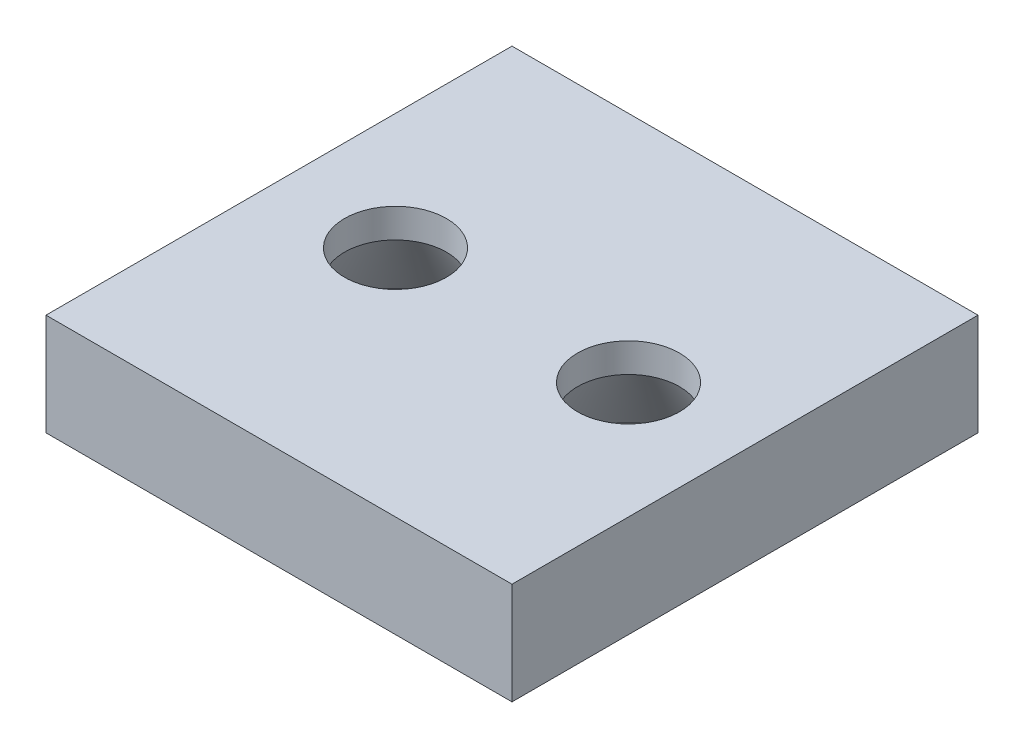
ISO-10303-21;
HEADER;
FILE_DESCRIPTION(('STEP AP214'),'2;1');
FILE_NAME('part.step','',(''),(''),'','','');
FILE_SCHEMA(('AUTOMOTIVE_DESIGN { 1 0 10303 214 1 1 1 1 }'));
ENDSEC;
DATA;
#1=APPLICATION_CONTEXT('core data for automotive mechanical design processes');
#2=APPLICATION_PROTOCOL_DEFINITION('international standard','automotive_design',2000,#1);
#3=PRODUCT_CONTEXT('',#1,'mechanical');
#4=PRODUCT('Part','Part','',(#3));
#5=PRODUCT_RELATED_PRODUCT_CATEGORY('part','',(#4));
#6=PRODUCT_DEFINITION_FORMATION('','',#4);
#7=PRODUCT_DEFINITION_CONTEXT('part definition',#1,'design');
#8=PRODUCT_DEFINITION('design','',#6,#7);
#9=PRODUCT_DEFINITION_SHAPE('','',#8);
#10=(LENGTH_UNIT() NAMED_UNIT(*) SI_UNIT(.MILLI.,.METRE.));
#11=(NAMED_UNIT(*) PLANE_ANGLE_UNIT() SI_UNIT($,.RADIAN.));
#12=(NAMED_UNIT(*) SI_UNIT($,.STERADIAN.) SOLID_ANGLE_UNIT());
#13=UNCERTAINTY_MEASURE_WITH_UNIT(LENGTH_MEASURE(1.E-05),#10,'distance_accuracy_value','');
#14=(GEOMETRIC_REPRESENTATION_CONTEXT(3) GLOBAL_UNCERTAINTY_ASSIGNED_CONTEXT((#13)) GLOBAL_UNIT_ASSIGNED_CONTEXT((#10,
#11,#12)) REPRESENTATION_CONTEXT('',''));
#15=CARTESIAN_POINT('',(0.,0.,0.));
#16=DIRECTION('',(0.,0.,1.));
#17=DIRECTION('',(1.,0.,0.));
#18=AXIS2_PLACEMENT_3D('',#15,#16,#17);
#19=CARTESIAN_POINT('',(-16.,7.,-16.));
#20=DIRECTION('',(0.,0.,-1.));
#21=DIRECTION('',(-1.,0.,0.));
#22=AXIS2_PLACEMENT_3D('',#19,#20,#21);
#23=PLANE('',#22);
#24=DIRECTION('',(1.,0.,0.));
#25=VECTOR('',#24,1.);
#26=CARTESIAN_POINT('',(-16.,0.,-16.));
#27=LINE('',#26,#25);
#28=CARTESIAN_POINT('',(-16.,0.,-16.));
#29=VERTEX_POINT('',#28);
#30=CARTESIAN_POINT('',(16.,0.,-16.));
#31=VERTEX_POINT('',#30);
#32=EDGE_CURVE('E117',#29,#31,#27,.T.);
#33=ORIENTED_EDGE('',*,*,#32,.F.);
#34=DIRECTION('',(0.,-1.,0.));
#35=VECTOR('',#34,1.);
#36=CARTESIAN_POINT('',(-16.,7.,-16.));
#37=LINE('',#36,#35);
#38=CARTESIAN_POINT('',(-16.,7.,-16.));
#39=VERTEX_POINT('',#38);
#40=EDGE_CURVE('E11',#39,#29,#37,.T.);
#41=ORIENTED_EDGE('',*,*,#40,.F.);
#42=DIRECTION('',(1.,0.,0.));
#43=VECTOR('',#42,1.);
#44=CARTESIAN_POINT('',(-16.,7.,-16.));
#45=LINE('',#44,#43);
#46=CARTESIAN_POINT('',(16.,7.,-16.));
#47=VERTEX_POINT('',#46);
#48=EDGE_CURVE('E109',#39,#47,#45,.T.);
#49=ORIENTED_EDGE('',*,*,#48,.T.);
#50=DIRECTION('',(0.,-1.,0.));
#51=VECTOR('',#50,1.);
#52=CARTESIAN_POINT('',(16.,7.,-16.));
#53=LINE('',#52,#51);
#54=EDGE_CURVE('E85',#47,#31,#53,.T.);
#55=ORIENTED_EDGE('',*,*,#54,.T.);
#56=EDGE_LOOP('',(#33,#41,#49,#55));
#57=FACE_BOUND('',#56,.T.);
#58=ADVANCED_FACE('F43',(#57),#23,.T.);
#59=CARTESIAN_POINT('',(-16.,7.,-16.));
#60=DIRECTION('',(1.,0.,0.));
#61=DIRECTION('',(0.,0.,-1.));
#62=AXIS2_PLACEMENT_3D('',#59,#60,#61);
#63=PLANE('',#62);
#64=DIRECTION('',(0.,0.,1.));
#65=VECTOR('',#64,1.);
#66=CARTESIAN_POINT('',(-16.,0.,-16.));
#67=LINE('',#66,#65);
#68=CARTESIAN_POINT('',(-16.,0.,16.));
#69=VERTEX_POINT('',#68);
#70=EDGE_CURVE('E77',#29,#69,#67,.T.);
#71=ORIENTED_EDGE('',*,*,#70,.T.);
#72=DIRECTION('',(0.,-1.,0.));
#73=VECTOR('',#72,1.);
#74=CARTESIAN_POINT('',(-16.,7.,16.));
#75=LINE('',#74,#73);
#76=CARTESIAN_POINT('',(-16.,7.,16.));
#77=VERTEX_POINT('',#76);
#78=EDGE_CURVE('E53',#77,#69,#75,.T.);
#79=ORIENTED_EDGE('',*,*,#78,.F.);
#80=DIRECTION('',(0.,0.,1.));
#81=VECTOR('',#80,1.);
#82=CARTESIAN_POINT('',(-16.,7.,-16.));
#83=LINE('',#82,#81);
#84=EDGE_CURVE('E95',#39,#77,#83,.T.);
#85=ORIENTED_EDGE('',*,*,#84,.F.);
#86=ORIENTED_EDGE('',*,*,#40,.T.);
#87=EDGE_LOOP('',(#71,#79,#85,#86));
#88=FACE_BOUND('',#87,.T.);
#89=ADVANCED_FACE('F165',(#88),#63,.F.);
#90=CARTESIAN_POINT('',(-16.,7.,16.));
#91=DIRECTION('',(0.,0.,-1.));
#92=DIRECTION('',(-1.,0.,0.));
#93=AXIS2_PLACEMENT_3D('',#90,#91,#92);
#94=PLANE('',#93);
#95=DIRECTION('',(1.,0.,0.));
#96=VECTOR('',#95,1.);
#97=CARTESIAN_POINT('',(-16.,0.,16.));
#98=LINE('',#97,#96);
#99=CARTESIAN_POINT('',(16.,0.,16.));
#100=VERTEX_POINT('',#99);
#101=EDGE_CURVE('E103',#69,#100,#98,.T.);
#102=ORIENTED_EDGE('',*,*,#101,.T.);
#103=DIRECTION('',(0.,-1.,0.));
#104=VECTOR('',#103,1.);
#105=CARTESIAN_POINT('',(16.,7.,16.));
#106=LINE('',#105,#104);
#107=CARTESIAN_POINT('',(16.,7.,16.));
#108=VERTEX_POINT('',#107);
#109=EDGE_CURVE('E100',#108,#100,#106,.T.);
#110=ORIENTED_EDGE('',*,*,#109,.F.);
#111=DIRECTION('',(1.,0.,0.));
#112=VECTOR('',#111,1.);
#113=CARTESIAN_POINT('',(-16.,7.,16.));
#114=LINE('',#113,#112);
#115=EDGE_CURVE('E90',#77,#108,#114,.T.);
#116=ORIENTED_EDGE('',*,*,#115,.F.);
#117=ORIENTED_EDGE('',*,*,#78,.T.);
#118=EDGE_LOOP('',(#102,#110,#116,#117));
#119=FACE_BOUND('',#118,.T.);
#120=ADVANCED_FACE('F101',(#119),#94,.F.);
#121=CARTESIAN_POINT('',(16.,7.,-16.));
#122=DIRECTION('',(1.,0.,0.));
#123=DIRECTION('',(0.,0.,-1.));
#124=AXIS2_PLACEMENT_3D('',#121,#122,#123);
#125=PLANE('',#124);
#126=DIRECTION('',(0.,0.,1.));
#127=VECTOR('',#126,1.);
#128=CARTESIAN_POINT('',(16.,0.,-16.));
#129=LINE('',#128,#127);
#130=EDGE_CURVE('E121',#31,#100,#129,.T.);
#131=ORIENTED_EDGE('',*,*,#130,.F.);
#132=ORIENTED_EDGE('',*,*,#54,.F.);
#133=DIRECTION('',(0.,0.,1.));
#134=VECTOR('',#133,1.);
#135=CARTESIAN_POINT('',(16.,7.,-16.));
#136=LINE('',#135,#134);
#137=EDGE_CURVE('E94',#47,#108,#136,.T.);
#138=ORIENTED_EDGE('',*,*,#137,.T.);
#139=ORIENTED_EDGE('',*,*,#109,.T.);
#140=EDGE_LOOP('',(#131,#132,#138,#139));
#141=FACE_BOUND('',#140,.T.);
#142=ADVANCED_FACE('F107',(#141),#125,.T.);
#143=CARTESIAN_POINT('',(0.,7.,0.));
#144=DIRECTION('',(0.,-1.,0.));
#145=DIRECTION('',(0.,0.,-1.));
#146=AXIS2_PLACEMENT_3D('',#143,#144,#145);
#147=PLANE('',#146);
#148=CARTESIAN_POINT('',(-8.,7.,0.));
#149=DIRECTION('',(0.,-1.,0.));
#150=DIRECTION('',(0.,0.,-1.));
#151=AXIS2_PLACEMENT_3D('',#148,#149,#150);
#152=CIRCLE('',#151,3.5);
#153=CARTESIAN_POINT('',(-8.,7.,-3.5));
#154=VERTEX_POINT('',#153);
#155=EDGE_CURVE('E46',#154,#154,#152,.T.);
#156=ORIENTED_EDGE('',*,*,#155,.T.);
#157=EDGE_LOOP('',(#156));
#158=FACE_BOUND('',#157,.T.);
#159=CARTESIAN_POINT('',(8.,7.,0.));
#160=DIRECTION('',(0.,-1.,0.));
#161=DIRECTION('',(0.,0.,-1.));
#162=AXIS2_PLACEMENT_3D('',#159,#160,#161);
#163=CIRCLE('',#162,3.5);
#164=CARTESIAN_POINT('',(8.,7.,-3.5));
#165=VERTEX_POINT('',#164);
#166=EDGE_CURVE('E122',#165,#165,#163,.T.);
#167=ORIENTED_EDGE('',*,*,#166,.T.);
#168=EDGE_LOOP('',(#167));
#169=FACE_BOUND('',#168,.T.);
#170=ORIENTED_EDGE('',*,*,#48,.F.);
#171=ORIENTED_EDGE('',*,*,#84,.T.);
#172=ORIENTED_EDGE('',*,*,#115,.T.);
#173=ORIENTED_EDGE('',*,*,#137,.F.);
#174=EDGE_LOOP('',(#170,#171,#172,#173));
#175=FACE_BOUND('',#174,.T.);
#176=ADVANCED_FACE('F93',(#158,#169,#175),#147,.F.);
#177=CARTESIAN_POINT('',(0.,0.,0.));
#178=DIRECTION('',(0.,-1.,0.));
#179=DIRECTION('',(0.,0.,-1.));
#180=AXIS2_PLACEMENT_3D('',#177,#178,#179);
#181=PLANE('',#180);
#182=CARTESIAN_POINT('',(-8.,0.,0.));
#183=DIRECTION('',(0.,-1.,0.));
#184=DIRECTION('',(0.,0.,-1.));
#185=AXIS2_PLACEMENT_3D('',#182,#183,#184);
#186=CIRCLE('',#185,6.5);
#187=CARTESIAN_POINT('',(-8.,0.,-6.5));
#188=VERTEX_POINT('',#187);
#189=EDGE_CURVE('E150',#188,#188,#186,.T.);
#190=ORIENTED_EDGE('',*,*,#189,.F.);
#191=EDGE_LOOP('',(#190));
#192=FACE_BOUND('',#191,.T.);
#193=CARTESIAN_POINT('',(8.,0.,0.));
#194=DIRECTION('',(0.,-1.,0.));
#195=DIRECTION('',(0.,0.,-1.));
#196=AXIS2_PLACEMENT_3D('',#193,#194,#195);
#197=CIRCLE('',#196,6.5);
#198=CARTESIAN_POINT('',(8.,0.,-6.5));
#199=VERTEX_POINT('',#198);
#200=EDGE_CURVE('E139',#199,#199,#197,.T.);
#201=ORIENTED_EDGE('',*,*,#200,.F.);
#202=EDGE_LOOP('',(#201));
#203=FACE_BOUND('',#202,.T.);
#204=ORIENTED_EDGE('',*,*,#32,.T.);
#205=ORIENTED_EDGE('',*,*,#130,.T.);
#206=ORIENTED_EDGE('',*,*,#101,.F.);
#207=ORIENTED_EDGE('',*,*,#70,.F.);
#208=EDGE_LOOP('',(#204,#205,#206,#207));
#209=FACE_BOUND('',#208,.T.);
#210=ADVANCED_FACE('F157',(#192,#203,#209),#181,.T.);
#211=CARTESIAN_POINT('',(8.,0.,0.));
#212=DIRECTION('',(0.,-1.,0.));
#213=DIRECTION('',(0.,0.,-1.));
#214=AXIS2_PLACEMENT_3D('',#211,#212,#213);
#215=CYLINDRICAL_SURFACE('',#214,3.5);
#216=CARTESIAN_POINT('',(8.,4.99975404598916,0.));
#217=DIRECTION('',(0.,-1.,0.));
#218=DIRECTION('',(0.,0.,-1.));
#219=AXIS2_PLACEMENT_3D('',#216,#217,#218);
#220=CIRCLE('',#219,3.5);
#221=CARTESIAN_POINT('',(8.,4.99975404598916,-3.5));
#222=VERTEX_POINT('',#221);
#223=EDGE_CURVE('E134',#222,#222,#220,.T.);
#224=ORIENTED_EDGE('',*,*,#223,.T.);
#225=EDGE_LOOP('',(#224));
#226=FACE_BOUND('',#225,.T.);
#227=ORIENTED_EDGE('',*,*,#166,.F.);
#228=EDGE_LOOP('',(#227));
#229=FACE_BOUND('',#228,.T.);
#230=ADVANCED_FACE('F160',(#226,#229),#215,.F.);
#231=CARTESIAN_POINT('',(8.,0.,0.));
#232=DIRECTION('',(0.,-1.,0.));
#233=DIRECTION('',(0.,0.,-1.));
#234=AXIS2_PLACEMENT_3D('',#231,#232,#233);
#235=CONICAL_SURFACE('',#234,6.5,0.540441202880044);
#236=ORIENTED_EDGE('',*,*,#223,.F.);
#237=EDGE_LOOP('',(#236));
#238=FACE_BOUND('',#237,.T.);
#239=ORIENTED_EDGE('',*,*,#200,.T.);
#240=EDGE_LOOP('',(#239));
#241=FACE_BOUND('',#240,.T.);
#242=ADVANCED_FACE('F186',(#238,#241),#235,.F.);
#243=CARTESIAN_POINT('',(-8.,0.,0.));
#244=DIRECTION('',(0.,-1.,0.));
#245=DIRECTION('',(0.,0.,-1.));
#246=AXIS2_PLACEMENT_3D('',#243,#244,#245);
#247=CYLINDRICAL_SURFACE('',#246,3.5);
#248=CARTESIAN_POINT('',(-8.,4.99975404598916,0.));
#249=DIRECTION('',(0.,-1.,0.));
#250=DIRECTION('',(0.,0.,-1.));
#251=AXIS2_PLACEMENT_3D('',#248,#249,#250);
#252=CIRCLE('',#251,3.5);
#253=CARTESIAN_POINT('',(-8.,4.99975404598916,-3.5));
#254=VERTEX_POINT('',#253);
#255=EDGE_CURVE('E146',#254,#254,#252,.T.);
#256=ORIENTED_EDGE('',*,*,#255,.T.);
#257=EDGE_LOOP('',(#256));
#258=FACE_BOUND('',#257,.T.);
#259=ORIENTED_EDGE('',*,*,#155,.F.);
#260=EDGE_LOOP('',(#259));
#261=FACE_BOUND('',#260,.T.);
#262=ADVANCED_FACE('F189',(#258,#261),#247,.F.);
#263=CARTESIAN_POINT('',(-8.,0.,0.));
#264=DIRECTION('',(0.,-1.,0.));
#265=DIRECTION('',(0.,0.,-1.));
#266=AXIS2_PLACEMENT_3D('',#263,#264,#265);
#267=CONICAL_SURFACE('',#266,6.5,0.540441202880044);
#268=ORIENTED_EDGE('',*,*,#255,.F.);
#269=EDGE_LOOP('',(#268));
#270=FACE_BOUND('',#269,.T.);
#271=ORIENTED_EDGE('',*,*,#189,.T.);
#272=EDGE_LOOP('',(#271));
#273=FACE_BOUND('',#272,.T.);
#274=ADVANCED_FACE('F155',(#270,#273),#267,.F.);
#275=CLOSED_SHELL('',(#58,#89,#120,#142,#176,#210,#230,#242,#262,#274));
#276=MANIFOLD_SOLID_BREP('B2',#275);
#277=ADVANCED_BREP_SHAPE_REPRESENTATION('',(#18,#276),#14);
#278=SHAPE_DEFINITION_REPRESENTATION(#9,#277);
ENDSEC;
END-ISO-10303-21;
